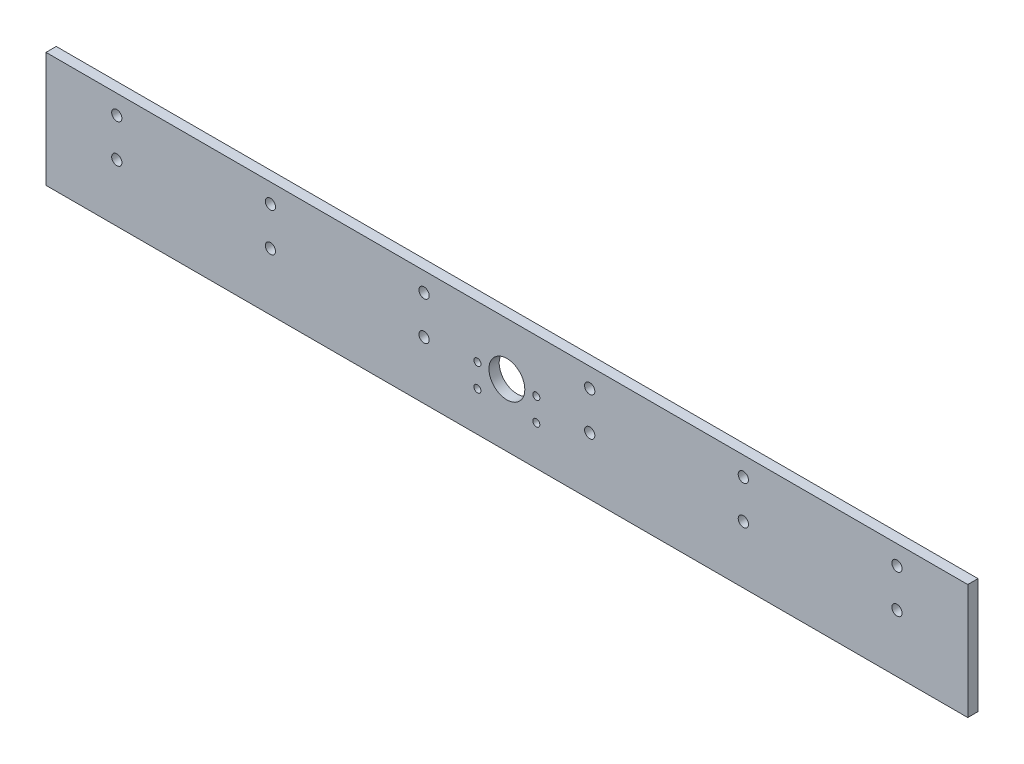
ISO-10303-21;
HEADER;
FILE_DESCRIPTION(('STEP AP214'),'2;1');
FILE_NAME('part.step','',(''),(''),'','','');
FILE_SCHEMA(('AUTOMOTIVE_DESIGN { 1 0 10303 214 1 1 1 1 }'));
ENDSEC;
DATA;
#1=APPLICATION_CONTEXT('core data for automotive mechanical design processes');
#2=APPLICATION_PROTOCOL_DEFINITION('international standard','automotive_design',2000,#1);
#3=PRODUCT_CONTEXT('',#1,'mechanical');
#4=PRODUCT('Part','Part','',(#3));
#5=PRODUCT_RELATED_PRODUCT_CATEGORY('part','',(#4));
#6=PRODUCT_DEFINITION_FORMATION('','',#4);
#7=PRODUCT_DEFINITION_CONTEXT('part definition',#1,'design');
#8=PRODUCT_DEFINITION('design','',#6,#7);
#9=PRODUCT_DEFINITION_SHAPE('','',#8);
#10=(LENGTH_UNIT() NAMED_UNIT(*) SI_UNIT(.MILLI.,.METRE.));
#11=(NAMED_UNIT(*) PLANE_ANGLE_UNIT() SI_UNIT($,.RADIAN.));
#12=(NAMED_UNIT(*) SI_UNIT($,.STERADIAN.) SOLID_ANGLE_UNIT());
#13=UNCERTAINTY_MEASURE_WITH_UNIT(LENGTH_MEASURE(1.E-05),#10,'distance_accuracy_value','');
#14=(GEOMETRIC_REPRESENTATION_CONTEXT(3) GLOBAL_UNCERTAINTY_ASSIGNED_CONTEXT((#13)) GLOBAL_UNIT_ASSIGNED_CONTEXT((#10,
#11,#12)) REPRESENTATION_CONTEXT('',''));
#15=CARTESIAN_POINT('',(0.,0.,0.));
#16=DIRECTION('',(0.,0.,1.));
#17=DIRECTION('',(1.,0.,0.));
#18=AXIS2_PLACEMENT_3D('',#15,#16,#17);
#19=CARTESIAN_POINT('',(0.,0.,8.));
#20=DIRECTION('',(0.,0.,-1.));
#21=DIRECTION('',(-1.,0.,0.));
#22=AXIS2_PLACEMENT_3D('',#19,#20,#21);
#23=PLANE('',#22);
#24=CARTESIAN_POINT('',(524.7,45.,8.));
#25=DIRECTION('',(0.,0.,1.));
#26=DIRECTION('',(-1.,0.,0.));
#27=AXIS2_PLACEMENT_3D('',#24,#25,#26);
#28=CIRCLE('',#27,3.99999999999999);
#29=CARTESIAN_POINT('',(520.7,45.,8.));
#30=VERTEX_POINT('',#29);
#31=EDGE_CURVE('E110',#30,#30,#28,.T.);
#32=ORIENTED_EDGE('',*,*,#31,.F.);
#33=EDGE_LOOP('',(#32));
#34=FACE_BOUND('',#33,.T.);
#35=CARTESIAN_POINT('',(404.7,45.,8.));
#36=DIRECTION('',(0.,0.,1.));
#37=DIRECTION('',(-1.,0.,0.));
#38=AXIS2_PLACEMENT_3D('',#35,#36,#37);
#39=CIRCLE('',#38,3.99999999999999);
#40=CARTESIAN_POINT('',(400.7,45.,8.));
#41=VERTEX_POINT('',#40);
#42=EDGE_CURVE('E122',#41,#41,#39,.T.);
#43=ORIENTED_EDGE('',*,*,#42,.F.);
#44=EDGE_LOOP('',(#43));
#45=FACE_BOUND('',#44,.T.);
#46=CARTESIAN_POINT('',(275.3,75.,8.));
#47=DIRECTION('',(0.,0.,1.));
#48=DIRECTION('',(1.,0.,0.));
#49=AXIS2_PLACEMENT_3D('',#46,#47,#48);
#50=CIRCLE('',#49,3.99999999999999);
#51=CARTESIAN_POINT('',(279.3,75.,8.));
#52=VERTEX_POINT('',#51);
#53=EDGE_CURVE('E134',#52,#52,#50,.T.);
#54=ORIENTED_EDGE('',*,*,#53,.F.);
#55=EDGE_LOOP('',(#54));
#56=FACE_BOUND('',#55,.T.);
#57=CARTESIAN_POINT('',(155.3,75.,8.));
#58=DIRECTION('',(0.,0.,1.));
#59=DIRECTION('',(1.,0.,0.));
#60=AXIS2_PLACEMENT_3D('',#57,#58,#59);
#61=CIRCLE('',#60,3.99999999999999);
#62=CARTESIAN_POINT('',(159.3,75.,8.));
#63=VERTEX_POINT('',#62);
#64=EDGE_CURVE('E146',#63,#63,#61,.T.);
#65=ORIENTED_EDGE('',*,*,#64,.F.);
#66=EDGE_LOOP('',(#65));
#67=FACE_BOUND('',#66,.T.);
#68=CARTESIAN_POINT('',(644.7,45.,8.));
#69=DIRECTION('',(0.,0.,1.));
#70=DIRECTION('',(-1.,0.,0.));
#71=AXIS2_PLACEMENT_3D('',#68,#69,#70);
#72=CIRCLE('',#71,3.99999999999999);
#73=CARTESIAN_POINT('',(640.7,45.,8.));
#74=VERTEX_POINT('',#73);
#75=EDGE_CURVE('E158',#74,#74,#72,.T.);
#76=ORIENTED_EDGE('',*,*,#75,.F.);
#77=EDGE_LOOP('',(#76));
#78=FACE_BOUND('',#77,.T.);
#79=CARTESIAN_POINT('',(35.3,75.,8.));
#80=DIRECTION('',(0.,0.,1.));
#81=DIRECTION('',(1.,0.,0.));
#82=AXIS2_PLACEMENT_3D('',#79,#80,#81);
#83=CIRCLE('',#82,4.00000000000001);
#84=CARTESIAN_POINT('',(39.3,75.,8.));
#85=VERTEX_POINT('',#84);
#86=EDGE_CURVE('E170',#85,#85,#83,.T.);
#87=ORIENTED_EDGE('',*,*,#86,.F.);
#88=EDGE_LOOP('',(#87));
#89=FACE_BOUND('',#88,.T.);
#90=CARTESIAN_POINT('',(363.000000000001,30.92,8.));
#91=DIRECTION('',(0.,0.,1.));
#92=DIRECTION('',(1.,0.,0.));
#93=AXIS2_PLACEMENT_3D('',#90,#91,#92);
#94=CIRCLE('',#93,2.74999999999998);
#95=CARTESIAN_POINT('',(365.750000000001,30.92,8.));
#96=VERTEX_POINT('',#95);
#97=EDGE_CURVE('E182',#96,#96,#94,.T.);
#98=ORIENTED_EDGE('',*,*,#97,.F.);
#99=EDGE_LOOP('',(#98));
#100=FACE_BOUND('',#99,.T.);
#101=CARTESIAN_POINT('',(340.,48.92,8.));
#102=DIRECTION('',(0.,0.,1.));
#103=DIRECTION('',(1.,0.,0.));
#104=AXIS2_PLACEMENT_3D('',#101,#102,#103);
#105=CIRCLE('',#104,14.);
#106=CARTESIAN_POINT('',(354.,48.92,8.));
#107=VERTEX_POINT('',#106);
#108=EDGE_CURVE('E194',#107,#107,#105,.T.);
#109=ORIENTED_EDGE('',*,*,#108,.F.);
#110=EDGE_LOOP('',(#109));
#111=FACE_BOUND('',#110,.T.);
#112=DIRECTION('',(-1.,0.,0.));
#113=VECTOR('',#112,1.);
#114=CARTESIAN_POINT('',(0.,90.,8.));
#115=LINE('',#114,#113);
#116=CARTESIAN_POINT('',(700.,90.0000000000001,8.));
#117=VERTEX_POINT('',#116);
#118=CARTESIAN_POINT('',(-20.,90.,8.));
#119=VERTEX_POINT('',#118);
#120=EDGE_CURVE('E11',#117,#119,#115,.T.);
#121=ORIENTED_EDGE('',*,*,#120,.T.);
#122=DIRECTION('',(0.,1.,0.));
#123=VECTOR('',#122,1.);
#124=CARTESIAN_POINT('',(-20.,90.,8.));
#125=LINE('',#124,#123);
#126=CARTESIAN_POINT('',(-20.,0.,8.));
#127=VERTEX_POINT('',#126);
#128=EDGE_CURVE('E75',#127,#119,#125,.T.);
#129=ORIENTED_EDGE('',*,*,#128,.F.);
#130=DIRECTION('',(1.,0.,0.));
#131=VECTOR('',#130,1.);
#132=CARTESIAN_POINT('',(0.,0.,8.));
#133=LINE('',#132,#131);
#134=CARTESIAN_POINT('',(700.,1.00242350743582E-13,8.));
#135=VERTEX_POINT('',#134);
#136=EDGE_CURVE('E41',#127,#135,#133,.T.);
#137=ORIENTED_EDGE('',*,*,#136,.T.);
#138=DIRECTION('',(0.,-1.,0.));
#139=VECTOR('',#138,1.);
#140=CARTESIAN_POINT('',(700.,90.0000000000001,8.));
#141=LINE('',#140,#139);
#142=EDGE_CURVE('E74',#117,#135,#141,.T.);
#143=ORIENTED_EDGE('',*,*,#142,.F.);
#144=EDGE_LOOP('',(#121,#129,#137,#143));
#145=FACE_BOUND('',#144,.T.);
#146=CARTESIAN_POINT('',(317.,48.92,8.));
#147=DIRECTION('',(0.,0.,1.));
#148=DIRECTION('',(1.,0.,0.));
#149=AXIS2_PLACEMENT_3D('',#146,#147,#148);
#150=CIRCLE('',#149,2.74999999999998);
#151=CARTESIAN_POINT('',(319.75,48.92,8.));
#152=VERTEX_POINT('',#151);
#153=EDGE_CURVE('E200',#152,#152,#150,.T.);
#154=ORIENTED_EDGE('',*,*,#153,.F.);
#155=EDGE_LOOP('',(#154));
#156=FACE_BOUND('',#155,.T.);
#157=CARTESIAN_POINT('',(363.,48.92,8.));
#158=DIRECTION('',(0.,0.,1.));
#159=DIRECTION('',(1.,0.,0.));
#160=AXIS2_PLACEMENT_3D('',#157,#158,#159);
#161=CIRCLE('',#160,2.74999999999998);
#162=CARTESIAN_POINT('',(365.75,48.92,8.));
#163=VERTEX_POINT('',#162);
#164=EDGE_CURVE('E188',#163,#163,#161,.T.);
#165=ORIENTED_EDGE('',*,*,#164,.F.);
#166=EDGE_LOOP('',(#165));
#167=FACE_BOUND('',#166,.T.);
#168=CARTESIAN_POINT('',(317.000000000001,30.92,8.));
#169=DIRECTION('',(0.,0.,1.));
#170=DIRECTION('',(1.,0.,0.));
#171=AXIS2_PLACEMENT_3D('',#168,#169,#170);
#172=CIRCLE('',#171,2.74999999999998);
#173=CARTESIAN_POINT('',(319.750000000001,30.92,8.));
#174=VERTEX_POINT('',#173);
#175=EDGE_CURVE('E176',#174,#174,#172,.T.);
#176=ORIENTED_EDGE('',*,*,#175,.F.);
#177=EDGE_LOOP('',(#176));
#178=FACE_BOUND('',#177,.T.);
#179=CARTESIAN_POINT('',(35.3,45.,8.));
#180=DIRECTION('',(0.,0.,1.));
#181=DIRECTION('',(1.,0.,0.));
#182=AXIS2_PLACEMENT_3D('',#179,#180,#181);
#183=CIRCLE('',#182,4.00000000000001);
#184=CARTESIAN_POINT('',(39.3,45.,8.));
#185=VERTEX_POINT('',#184);
#186=EDGE_CURVE('E164',#185,#185,#183,.T.);
#187=ORIENTED_EDGE('',*,*,#186,.F.);
#188=EDGE_LOOP('',(#187));
#189=FACE_BOUND('',#188,.T.);
#190=CARTESIAN_POINT('',(644.7,75.,8.));
#191=DIRECTION('',(0.,0.,1.));
#192=DIRECTION('',(-1.,0.,0.));
#193=AXIS2_PLACEMENT_3D('',#190,#191,#192);
#194=CIRCLE('',#193,3.99999999999999);
#195=CARTESIAN_POINT('',(640.7,75.,8.));
#196=VERTEX_POINT('',#195);
#197=EDGE_CURVE('E152',#196,#196,#194,.T.);
#198=ORIENTED_EDGE('',*,*,#197,.F.);
#199=EDGE_LOOP('',(#198));
#200=FACE_BOUND('',#199,.T.);
#201=CARTESIAN_POINT('',(155.3,45.,8.));
#202=DIRECTION('',(0.,0.,1.));
#203=DIRECTION('',(1.,0.,0.));
#204=AXIS2_PLACEMENT_3D('',#201,#202,#203);
#205=CIRCLE('',#204,3.99999999999999);
#206=CARTESIAN_POINT('',(159.3,45.,8.));
#207=VERTEX_POINT('',#206);
#208=EDGE_CURVE('E140',#207,#207,#205,.T.);
#209=ORIENTED_EDGE('',*,*,#208,.F.);
#210=EDGE_LOOP('',(#209));
#211=FACE_BOUND('',#210,.T.);
#212=CARTESIAN_POINT('',(275.3,45.,8.));
#213=DIRECTION('',(0.,0.,1.));
#214=DIRECTION('',(1.,0.,0.));
#215=AXIS2_PLACEMENT_3D('',#212,#213,#214);
#216=CIRCLE('',#215,3.99999999999999);
#217=CARTESIAN_POINT('',(279.3,45.,8.));
#218=VERTEX_POINT('',#217);
#219=EDGE_CURVE('E128',#218,#218,#216,.T.);
#220=ORIENTED_EDGE('',*,*,#219,.F.);
#221=EDGE_LOOP('',(#220));
#222=FACE_BOUND('',#221,.T.);
#223=CARTESIAN_POINT('',(404.7,75.,8.));
#224=DIRECTION('',(0.,0.,1.));
#225=DIRECTION('',(-1.,0.,0.));
#226=AXIS2_PLACEMENT_3D('',#223,#224,#225);
#227=CIRCLE('',#226,3.99999999999999);
#228=CARTESIAN_POINT('',(400.7,75.,8.));
#229=VERTEX_POINT('',#228);
#230=EDGE_CURVE('E116',#229,#229,#227,.T.);
#231=ORIENTED_EDGE('',*,*,#230,.F.);
#232=EDGE_LOOP('',(#231));
#233=FACE_BOUND('',#232,.T.);
#234=CARTESIAN_POINT('',(524.7,75.,8.));
#235=DIRECTION('',(0.,0.,1.));
#236=DIRECTION('',(-1.,0.,0.));
#237=AXIS2_PLACEMENT_3D('',#234,#235,#236);
#238=CIRCLE('',#237,3.99999999999999);
#239=CARTESIAN_POINT('',(520.7,75.,8.));
#240=VERTEX_POINT('',#239);
#241=EDGE_CURVE('E104',#240,#240,#238,.T.);
#242=ORIENTED_EDGE('',*,*,#241,.F.);
#243=EDGE_LOOP('',(#242));
#244=FACE_BOUND('',#243,.T.);
#245=ADVANCED_FACE('F32',(#34,#45,#56,#67,#78,#89,#100,#111,#145,#156,#167,#178,#189,#200,#211,
#222,#233,#244),#23,.F.);
#246=CARTESIAN_POINT('',(0.,0.,0.));
#247=DIRECTION('',(0.,0.,-1.));
#248=DIRECTION('',(-1.,0.,0.));
#249=AXIS2_PLACEMENT_3D('',#246,#247,#248);
#250=PLANE('',#249);
#251=CARTESIAN_POINT('',(524.7,45.,0.));
#252=DIRECTION('',(0.,0.,1.));
#253=DIRECTION('',(-1.,0.,0.));
#254=AXIS2_PLACEMENT_3D('',#251,#252,#253);
#255=CIRCLE('',#254,3.99999999999999);
#256=CARTESIAN_POINT('',(520.7,45.,0.));
#257=VERTEX_POINT('',#256);
#258=EDGE_CURVE('E107',#257,#257,#255,.T.);
#259=ORIENTED_EDGE('',*,*,#258,.T.);
#260=EDGE_LOOP('',(#259));
#261=FACE_BOUND('',#260,.T.);
#262=CARTESIAN_POINT('',(404.7,45.,0.));
#263=DIRECTION('',(0.,0.,1.));
#264=DIRECTION('',(-1.,0.,0.));
#265=AXIS2_PLACEMENT_3D('',#262,#263,#264);
#266=CIRCLE('',#265,3.99999999999999);
#267=CARTESIAN_POINT('',(400.7,45.,0.));
#268=VERTEX_POINT('',#267);
#269=EDGE_CURVE('E119',#268,#268,#266,.T.);
#270=ORIENTED_EDGE('',*,*,#269,.T.);
#271=EDGE_LOOP('',(#270));
#272=FACE_BOUND('',#271,.T.);
#273=CARTESIAN_POINT('',(275.3,75.,0.));
#274=DIRECTION('',(0.,0.,1.));
#275=DIRECTION('',(1.,0.,0.));
#276=AXIS2_PLACEMENT_3D('',#273,#274,#275);
#277=CIRCLE('',#276,3.99999999999999);
#278=CARTESIAN_POINT('',(279.3,75.,0.));
#279=VERTEX_POINT('',#278);
#280=EDGE_CURVE('E131',#279,#279,#277,.T.);
#281=ORIENTED_EDGE('',*,*,#280,.T.);
#282=EDGE_LOOP('',(#281));
#283=FACE_BOUND('',#282,.T.);
#284=CARTESIAN_POINT('',(155.3,75.,0.));
#285=DIRECTION('',(0.,0.,1.));
#286=DIRECTION('',(1.,0.,0.));
#287=AXIS2_PLACEMENT_3D('',#284,#285,#286);
#288=CIRCLE('',#287,3.99999999999999);
#289=CARTESIAN_POINT('',(159.3,75.,0.));
#290=VERTEX_POINT('',#289);
#291=EDGE_CURVE('E143',#290,#290,#288,.T.);
#292=ORIENTED_EDGE('',*,*,#291,.T.);
#293=EDGE_LOOP('',(#292));
#294=FACE_BOUND('',#293,.T.);
#295=CARTESIAN_POINT('',(644.7,45.,0.));
#296=DIRECTION('',(0.,0.,1.));
#297=DIRECTION('',(-1.,0.,0.));
#298=AXIS2_PLACEMENT_3D('',#295,#296,#297);
#299=CIRCLE('',#298,3.99999999999999);
#300=CARTESIAN_POINT('',(640.7,45.,0.));
#301=VERTEX_POINT('',#300);
#302=EDGE_CURVE('E155',#301,#301,#299,.T.);
#303=ORIENTED_EDGE('',*,*,#302,.T.);
#304=EDGE_LOOP('',(#303));
#305=FACE_BOUND('',#304,.T.);
#306=CARTESIAN_POINT('',(35.3,75.,0.));
#307=DIRECTION('',(0.,0.,1.));
#308=DIRECTION('',(1.,0.,0.));
#309=AXIS2_PLACEMENT_3D('',#306,#307,#308);
#310=CIRCLE('',#309,4.00000000000001);
#311=CARTESIAN_POINT('',(39.3,75.,0.));
#312=VERTEX_POINT('',#311);
#313=EDGE_CURVE('E167',#312,#312,#310,.T.);
#314=ORIENTED_EDGE('',*,*,#313,.T.);
#315=EDGE_LOOP('',(#314));
#316=FACE_BOUND('',#315,.T.);
#317=CARTESIAN_POINT('',(363.000000000001,30.92,0.));
#318=DIRECTION('',(0.,0.,1.));
#319=DIRECTION('',(1.,0.,0.));
#320=AXIS2_PLACEMENT_3D('',#317,#318,#319);
#321=CIRCLE('',#320,2.74999999999998);
#322=CARTESIAN_POINT('',(365.750000000001,30.92,0.));
#323=VERTEX_POINT('',#322);
#324=EDGE_CURVE('E179',#323,#323,#321,.T.);
#325=ORIENTED_EDGE('',*,*,#324,.T.);
#326=EDGE_LOOP('',(#325));
#327=FACE_BOUND('',#326,.T.);
#328=CARTESIAN_POINT('',(340.,48.92,0.));
#329=DIRECTION('',(0.,0.,1.));
#330=DIRECTION('',(1.,0.,0.));
#331=AXIS2_PLACEMENT_3D('',#328,#329,#330);
#332=CIRCLE('',#331,14.);
#333=CARTESIAN_POINT('',(354.,48.92,0.));
#334=VERTEX_POINT('',#333);
#335=EDGE_CURVE('E191',#334,#334,#332,.T.);
#336=ORIENTED_EDGE('',*,*,#335,.T.);
#337=EDGE_LOOP('',(#336));
#338=FACE_BOUND('',#337,.T.);
#339=DIRECTION('',(1.,0.,0.));
#340=VECTOR('',#339,1.);
#341=CARTESIAN_POINT('',(0.,0.,0.));
#342=LINE('',#341,#340);
#343=CARTESIAN_POINT('',(-20.,0.,0.));
#344=VERTEX_POINT('',#343);
#345=CARTESIAN_POINT('',(700.,1.00242350743582E-13,0.));
#346=VERTEX_POINT('',#345);
#347=EDGE_CURVE('E82',#344,#346,#342,.T.);
#348=ORIENTED_EDGE('',*,*,#347,.F.);
#349=DIRECTION('',(0.,-1.,0.));
#350=VECTOR('',#349,1.);
#351=CARTESIAN_POINT('',(-20.,90.,0.));
#352=LINE('',#351,#350);
#353=CARTESIAN_POINT('',(-20.,90.,0.));
#354=VERTEX_POINT('',#353);
#355=EDGE_CURVE('E95',#354,#344,#352,.T.);
#356=ORIENTED_EDGE('',*,*,#355,.F.);
#357=DIRECTION('',(-1.,0.,0.));
#358=VECTOR('',#357,1.);
#359=CARTESIAN_POINT('',(0.,90.,0.));
#360=LINE('',#359,#358);
#361=CARTESIAN_POINT('',(700.,90.0000000000001,0.));
#362=VERTEX_POINT('',#361);
#363=EDGE_CURVE('E36',#362,#354,#360,.T.);
#364=ORIENTED_EDGE('',*,*,#363,.F.);
#365=DIRECTION('',(0.,1.,0.));
#366=VECTOR('',#365,1.);
#367=CARTESIAN_POINT('',(700.,90.0000000000001,0.));
#368=LINE('',#367,#366);
#369=EDGE_CURVE('E86',#346,#362,#368,.T.);
#370=ORIENTED_EDGE('',*,*,#369,.F.);
#371=EDGE_LOOP('',(#348,#356,#364,#370));
#372=FACE_BOUND('',#371,.T.);
#373=CARTESIAN_POINT('',(317.,48.92,0.));
#374=DIRECTION('',(0.,0.,1.));
#375=DIRECTION('',(1.,0.,0.));
#376=AXIS2_PLACEMENT_3D('',#373,#374,#375);
#377=CIRCLE('',#376,2.74999999999998);
#378=CARTESIAN_POINT('',(319.75,48.92,0.));
#379=VERTEX_POINT('',#378);
#380=EDGE_CURVE('E197',#379,#379,#377,.T.);
#381=ORIENTED_EDGE('',*,*,#380,.T.);
#382=EDGE_LOOP('',(#381));
#383=FACE_BOUND('',#382,.T.);
#384=CARTESIAN_POINT('',(363.,48.92,0.));
#385=DIRECTION('',(0.,0.,1.));
#386=DIRECTION('',(1.,0.,0.));
#387=AXIS2_PLACEMENT_3D('',#384,#385,#386);
#388=CIRCLE('',#387,2.74999999999998);
#389=CARTESIAN_POINT('',(365.75,48.92,0.));
#390=VERTEX_POINT('',#389);
#391=EDGE_CURVE('E185',#390,#390,#388,.T.);
#392=ORIENTED_EDGE('',*,*,#391,.T.);
#393=EDGE_LOOP('',(#392));
#394=FACE_BOUND('',#393,.T.);
#395=CARTESIAN_POINT('',(317.000000000001,30.92,0.));
#396=DIRECTION('',(0.,0.,1.));
#397=DIRECTION('',(1.,0.,0.));
#398=AXIS2_PLACEMENT_3D('',#395,#396,#397);
#399=CIRCLE('',#398,2.74999999999998);
#400=CARTESIAN_POINT('',(319.750000000001,30.92,0.));
#401=VERTEX_POINT('',#400);
#402=EDGE_CURVE('E173',#401,#401,#399,.T.);
#403=ORIENTED_EDGE('',*,*,#402,.T.);
#404=EDGE_LOOP('',(#403));
#405=FACE_BOUND('',#404,.T.);
#406=CARTESIAN_POINT('',(35.3,45.,0.));
#407=DIRECTION('',(0.,0.,1.));
#408=DIRECTION('',(1.,0.,0.));
#409=AXIS2_PLACEMENT_3D('',#406,#407,#408);
#410=CIRCLE('',#409,4.00000000000001);
#411=CARTESIAN_POINT('',(39.3,45.,0.));
#412=VERTEX_POINT('',#411);
#413=EDGE_CURVE('E161',#412,#412,#410,.T.);
#414=ORIENTED_EDGE('',*,*,#413,.T.);
#415=EDGE_LOOP('',(#414));
#416=FACE_BOUND('',#415,.T.);
#417=CARTESIAN_POINT('',(644.7,75.,0.));
#418=DIRECTION('',(0.,0.,1.));
#419=DIRECTION('',(-1.,0.,0.));
#420=AXIS2_PLACEMENT_3D('',#417,#418,#419);
#421=CIRCLE('',#420,3.99999999999999);
#422=CARTESIAN_POINT('',(640.7,75.,0.));
#423=VERTEX_POINT('',#422);
#424=EDGE_CURVE('E149',#423,#423,#421,.T.);
#425=ORIENTED_EDGE('',*,*,#424,.T.);
#426=EDGE_LOOP('',(#425));
#427=FACE_BOUND('',#426,.T.);
#428=CARTESIAN_POINT('',(155.3,45.,0.));
#429=DIRECTION('',(0.,0.,1.));
#430=DIRECTION('',(1.,0.,0.));
#431=AXIS2_PLACEMENT_3D('',#428,#429,#430);
#432=CIRCLE('',#431,3.99999999999999);
#433=CARTESIAN_POINT('',(159.3,45.,0.));
#434=VERTEX_POINT('',#433);
#435=EDGE_CURVE('E137',#434,#434,#432,.T.);
#436=ORIENTED_EDGE('',*,*,#435,.T.);
#437=EDGE_LOOP('',(#436));
#438=FACE_BOUND('',#437,.T.);
#439=CARTESIAN_POINT('',(275.3,45.,0.));
#440=DIRECTION('',(0.,0.,1.));
#441=DIRECTION('',(1.,0.,0.));
#442=AXIS2_PLACEMENT_3D('',#439,#440,#441);
#443=CIRCLE('',#442,3.99999999999999);
#444=CARTESIAN_POINT('',(279.3,45.,0.));
#445=VERTEX_POINT('',#444);
#446=EDGE_CURVE('E125',#445,#445,#443,.T.);
#447=ORIENTED_EDGE('',*,*,#446,.T.);
#448=EDGE_LOOP('',(#447));
#449=FACE_BOUND('',#448,.T.);
#450=CARTESIAN_POINT('',(404.7,75.,0.));
#451=DIRECTION('',(0.,0.,1.));
#452=DIRECTION('',(-1.,0.,0.));
#453=AXIS2_PLACEMENT_3D('',#450,#451,#452);
#454=CIRCLE('',#453,3.99999999999999);
#455=CARTESIAN_POINT('',(400.7,75.,0.));
#456=VERTEX_POINT('',#455);
#457=EDGE_CURVE('E113',#456,#456,#454,.T.);
#458=ORIENTED_EDGE('',*,*,#457,.T.);
#459=EDGE_LOOP('',(#458));
#460=FACE_BOUND('',#459,.T.);
#461=CARTESIAN_POINT('',(524.7,75.,0.));
#462=DIRECTION('',(0.,0.,1.));
#463=DIRECTION('',(-1.,0.,0.));
#464=AXIS2_PLACEMENT_3D('',#461,#462,#463);
#465=CIRCLE('',#464,3.99999999999999);
#466=CARTESIAN_POINT('',(520.7,75.,0.));
#467=VERTEX_POINT('',#466);
#468=EDGE_CURVE('E103',#467,#467,#465,.T.);
#469=ORIENTED_EDGE('',*,*,#468,.T.);
#470=EDGE_LOOP('',(#469));
#471=FACE_BOUND('',#470,.T.);
#472=ADVANCED_FACE('F206',(#261,#272,#283,#294,#305,#316,#327,#338,#372,#383,#394,#405,#416,
#427,#438,#449,#460,#471),#250,.T.);
#473=CARTESIAN_POINT('',(0.,0.,8.));
#474=DIRECTION('',(0.,1.,0.));
#475=DIRECTION('',(-1.,0.,0.));
#476=AXIS2_PLACEMENT_3D('',#473,#474,#475);
#477=PLANE('',#476);
#478=ORIENTED_EDGE('',*,*,#347,.T.);
#479=DIRECTION('',(0.,0.,-1.));
#480=VECTOR('',#479,1.);
#481=CARTESIAN_POINT('',(700.,1.00242350743582E-13,8.));
#482=LINE('',#481,#480);
#483=EDGE_CURVE('E81',#135,#346,#482,.T.);
#484=ORIENTED_EDGE('',*,*,#483,.F.);
#485=ORIENTED_EDGE('',*,*,#136,.F.);
#486=DIRECTION('',(0.,0.,1.));
#487=VECTOR('',#486,1.);
#488=CARTESIAN_POINT('',(-20.,0.,0.));
#489=LINE('',#488,#487);
#490=EDGE_CURVE('E98',#344,#127,#489,.T.);
#491=ORIENTED_EDGE('',*,*,#490,.F.);
#492=EDGE_LOOP('',(#478,#484,#485,#491));
#493=FACE_BOUND('',#492,.T.);
#494=ADVANCED_FACE('F34',(#493),#477,.F.);
#495=CARTESIAN_POINT('',(0.,90.,8.));
#496=DIRECTION('',(0.,-1.,0.));
#497=DIRECTION('',(1.,0.,0.));
#498=AXIS2_PLACEMENT_3D('',#495,#496,#497);
#499=PLANE('',#498);
#500=ORIENTED_EDGE('',*,*,#363,.T.);
#501=DIRECTION('',(0.,0.,-1.));
#502=VECTOR('',#501,1.);
#503=CARTESIAN_POINT('',(-20.,90.,0.));
#504=LINE('',#503,#502);
#505=EDGE_CURVE('E101',#119,#354,#504,.T.);
#506=ORIENTED_EDGE('',*,*,#505,.F.);
#507=ORIENTED_EDGE('',*,*,#120,.F.);
#508=DIRECTION('',(0.,0.,1.));
#509=VECTOR('',#508,1.);
#510=CARTESIAN_POINT('',(700.,90.0000000000001,8.));
#511=LINE('',#510,#509);
#512=EDGE_CURVE('E90',#362,#117,#511,.T.);
#513=ORIENTED_EDGE('',*,*,#512,.F.);
#514=EDGE_LOOP('',(#500,#506,#507,#513));
#515=FACE_BOUND('',#514,.T.);
#516=ADVANCED_FACE('F212',(#515),#499,.F.);
#517=CARTESIAN_POINT('',(317.,48.92,8.));
#518=DIRECTION('',(0.,0.,-1.));
#519=DIRECTION('',(-1.,0.,0.));
#520=AXIS2_PLACEMENT_3D('',#517,#518,#519);
#521=CYLINDRICAL_SURFACE('',#520,2.74999999999998);
#522=ORIENTED_EDGE('',*,*,#153,.T.);
#523=EDGE_LOOP('',(#522));
#524=FACE_BOUND('',#523,.T.);
#525=ORIENTED_EDGE('',*,*,#380,.F.);
#526=EDGE_LOOP('',(#525));
#527=FACE_BOUND('',#526,.T.);
#528=ADVANCED_FACE('F209',(#524,#527),#521,.F.);
#529=CARTESIAN_POINT('',(340.,48.92,8.));
#530=DIRECTION('',(0.,0.,-1.));
#531=DIRECTION('',(-1.,0.,0.));
#532=AXIS2_PLACEMENT_3D('',#529,#530,#531);
#533=CYLINDRICAL_SURFACE('',#532,14.);
#534=ORIENTED_EDGE('',*,*,#108,.T.);
#535=EDGE_LOOP('',(#534));
#536=FACE_BOUND('',#535,.T.);
#537=ORIENTED_EDGE('',*,*,#335,.F.);
#538=EDGE_LOOP('',(#537));
#539=FACE_BOUND('',#538,.T.);
#540=ADVANCED_FACE('F211',(#536,#539),#533,.F.);
#541=CARTESIAN_POINT('',(363.,48.92,8.));
#542=DIRECTION('',(0.,0.,-1.));
#543=DIRECTION('',(-1.,0.,0.));
#544=AXIS2_PLACEMENT_3D('',#541,#542,#543);
#545=CYLINDRICAL_SURFACE('',#544,2.74999999999998);
#546=ORIENTED_EDGE('',*,*,#164,.T.);
#547=EDGE_LOOP('',(#546));
#548=FACE_BOUND('',#547,.T.);
#549=ORIENTED_EDGE('',*,*,#391,.F.);
#550=EDGE_LOOP('',(#549));
#551=FACE_BOUND('',#550,.T.);
#552=ADVANCED_FACE('F219',(#548,#551),#545,.F.);
#553=CARTESIAN_POINT('',(363.000000000001,30.92,8.));
#554=DIRECTION('',(0.,0.,-1.));
#555=DIRECTION('',(-1.,0.,0.));
#556=AXIS2_PLACEMENT_3D('',#553,#554,#555);
#557=CYLINDRICAL_SURFACE('',#556,2.74999999999998);
#558=ORIENTED_EDGE('',*,*,#97,.T.);
#559=EDGE_LOOP('',(#558));
#560=FACE_BOUND('',#559,.T.);
#561=ORIENTED_EDGE('',*,*,#324,.F.);
#562=EDGE_LOOP('',(#561));
#563=FACE_BOUND('',#562,.T.);
#564=ADVANCED_FACE('F310',(#560,#563),#557,.F.);
#565=CARTESIAN_POINT('',(317.000000000001,30.92,8.));
#566=DIRECTION('',(0.,0.,-1.));
#567=DIRECTION('',(-1.,0.,0.));
#568=AXIS2_PLACEMENT_3D('',#565,#566,#567);
#569=CYLINDRICAL_SURFACE('',#568,2.74999999999998);
#570=ORIENTED_EDGE('',*,*,#175,.T.);
#571=EDGE_LOOP('',(#570));
#572=FACE_BOUND('',#571,.T.);
#573=ORIENTED_EDGE('',*,*,#402,.F.);
#574=EDGE_LOOP('',(#573));
#575=FACE_BOUND('',#574,.T.);
#576=ADVANCED_FACE('F306',(#572,#575),#569,.F.);
#577=CARTESIAN_POINT('',(35.3,75.,8.));
#578=DIRECTION('',(0.,0.,-1.));
#579=DIRECTION('',(-1.,0.,0.));
#580=AXIS2_PLACEMENT_3D('',#577,#578,#579);
#581=CYLINDRICAL_SURFACE('',#580,4.00000000000001);
#582=ORIENTED_EDGE('',*,*,#86,.T.);
#583=EDGE_LOOP('',(#582));
#584=FACE_BOUND('',#583,.T.);
#585=ORIENTED_EDGE('',*,*,#313,.F.);
#586=EDGE_LOOP('',(#585));
#587=FACE_BOUND('',#586,.T.);
#588=ADVANCED_FACE('F302',(#584,#587),#581,.F.);
#589=CARTESIAN_POINT('',(35.3,45.,8.));
#590=DIRECTION('',(0.,0.,-1.));
#591=DIRECTION('',(-1.,0.,0.));
#592=AXIS2_PLACEMENT_3D('',#589,#590,#591);
#593=CYLINDRICAL_SURFACE('',#592,4.00000000000001);
#594=ORIENTED_EDGE('',*,*,#186,.T.);
#595=EDGE_LOOP('',(#594));
#596=FACE_BOUND('',#595,.T.);
#597=ORIENTED_EDGE('',*,*,#413,.F.);
#598=EDGE_LOOP('',(#597));
#599=FACE_BOUND('',#598,.T.);
#600=ADVANCED_FACE('F298',(#596,#599),#593,.F.);
#601=CARTESIAN_POINT('',(644.7,45.,8.));
#602=DIRECTION('',(0.,0.,-1.));
#603=DIRECTION('',(-1.,0.,0.));
#604=AXIS2_PLACEMENT_3D('',#601,#602,#603);
#605=CYLINDRICAL_SURFACE('',#604,3.99999999999999);
#606=ORIENTED_EDGE('',*,*,#75,.T.);
#607=EDGE_LOOP('',(#606));
#608=FACE_BOUND('',#607,.T.);
#609=ORIENTED_EDGE('',*,*,#302,.F.);
#610=EDGE_LOOP('',(#609));
#611=FACE_BOUND('',#610,.T.);
#612=ADVANCED_FACE('F294',(#608,#611),#605,.F.);
#613=CARTESIAN_POINT('',(644.7,75.,8.));
#614=DIRECTION('',(0.,0.,-1.));
#615=DIRECTION('',(-1.,0.,0.));
#616=AXIS2_PLACEMENT_3D('',#613,#614,#615);
#617=CYLINDRICAL_SURFACE('',#616,3.99999999999999);
#618=ORIENTED_EDGE('',*,*,#197,.T.);
#619=EDGE_LOOP('',(#618));
#620=FACE_BOUND('',#619,.T.);
#621=ORIENTED_EDGE('',*,*,#424,.F.);
#622=EDGE_LOOP('',(#621));
#623=FACE_BOUND('',#622,.T.);
#624=ADVANCED_FACE('F290',(#620,#623),#617,.F.);
#625=CARTESIAN_POINT('',(155.3,75.,8.));
#626=DIRECTION('',(0.,0.,-1.));
#627=DIRECTION('',(-1.,0.,0.));
#628=AXIS2_PLACEMENT_3D('',#625,#626,#627);
#629=CYLINDRICAL_SURFACE('',#628,3.99999999999999);
#630=ORIENTED_EDGE('',*,*,#64,.T.);
#631=EDGE_LOOP('',(#630));
#632=FACE_BOUND('',#631,.T.);
#633=ORIENTED_EDGE('',*,*,#291,.F.);
#634=EDGE_LOOP('',(#633));
#635=FACE_BOUND('',#634,.T.);
#636=ADVANCED_FACE('F286',(#632,#635),#629,.F.);
#637=CARTESIAN_POINT('',(155.3,45.,8.));
#638=DIRECTION('',(0.,0.,-1.));
#639=DIRECTION('',(-1.,0.,0.));
#640=AXIS2_PLACEMENT_3D('',#637,#638,#639);
#641=CYLINDRICAL_SURFACE('',#640,3.99999999999999);
#642=ORIENTED_EDGE('',*,*,#208,.T.);
#643=EDGE_LOOP('',(#642));
#644=FACE_BOUND('',#643,.T.);
#645=ORIENTED_EDGE('',*,*,#435,.F.);
#646=EDGE_LOOP('',(#645));
#647=FACE_BOUND('',#646,.T.);
#648=ADVANCED_FACE('F282',(#644,#647),#641,.F.);
#649=CARTESIAN_POINT('',(275.3,75.,8.));
#650=DIRECTION('',(0.,0.,-1.));
#651=DIRECTION('',(-1.,0.,0.));
#652=AXIS2_PLACEMENT_3D('',#649,#650,#651);
#653=CYLINDRICAL_SURFACE('',#652,3.99999999999999);
#654=ORIENTED_EDGE('',*,*,#53,.T.);
#655=EDGE_LOOP('',(#654));
#656=FACE_BOUND('',#655,.T.);
#657=ORIENTED_EDGE('',*,*,#280,.F.);
#658=EDGE_LOOP('',(#657));
#659=FACE_BOUND('',#658,.T.);
#660=ADVANCED_FACE('F278',(#656,#659),#653,.F.);
#661=CARTESIAN_POINT('',(275.3,45.,8.));
#662=DIRECTION('',(0.,0.,-1.));
#663=DIRECTION('',(-1.,0.,0.));
#664=AXIS2_PLACEMENT_3D('',#661,#662,#663);
#665=CYLINDRICAL_SURFACE('',#664,3.99999999999999);
#666=ORIENTED_EDGE('',*,*,#219,.T.);
#667=EDGE_LOOP('',(#666));
#668=FACE_BOUND('',#667,.T.);
#669=ORIENTED_EDGE('',*,*,#446,.F.);
#670=EDGE_LOOP('',(#669));
#671=FACE_BOUND('',#670,.T.);
#672=ADVANCED_FACE('F274',(#668,#671),#665,.F.);
#673=CARTESIAN_POINT('',(404.7,45.,8.));
#674=DIRECTION('',(0.,0.,-1.));
#675=DIRECTION('',(-1.,0.,0.));
#676=AXIS2_PLACEMENT_3D('',#673,#674,#675);
#677=CYLINDRICAL_SURFACE('',#676,3.99999999999999);
#678=ORIENTED_EDGE('',*,*,#42,.T.);
#679=EDGE_LOOP('',(#678));
#680=FACE_BOUND('',#679,.T.);
#681=ORIENTED_EDGE('',*,*,#269,.F.);
#682=EDGE_LOOP('',(#681));
#683=FACE_BOUND('',#682,.T.);
#684=ADVANCED_FACE('F270',(#680,#683),#677,.F.);
#685=CARTESIAN_POINT('',(404.7,75.,8.));
#686=DIRECTION('',(0.,0.,-1.));
#687=DIRECTION('',(-1.,0.,0.));
#688=AXIS2_PLACEMENT_3D('',#685,#686,#687);
#689=CYLINDRICAL_SURFACE('',#688,3.99999999999999);
#690=ORIENTED_EDGE('',*,*,#230,.T.);
#691=EDGE_LOOP('',(#690));
#692=FACE_BOUND('',#691,.T.);
#693=ORIENTED_EDGE('',*,*,#457,.F.);
#694=EDGE_LOOP('',(#693));
#695=FACE_BOUND('',#694,.T.);
#696=ADVANCED_FACE('F266',(#692,#695),#689,.F.);
#697=CARTESIAN_POINT('',(524.7,45.,8.));
#698=DIRECTION('',(0.,0.,-1.));
#699=DIRECTION('',(-1.,0.,0.));
#700=AXIS2_PLACEMENT_3D('',#697,#698,#699);
#701=CYLINDRICAL_SURFACE('',#700,3.99999999999999);
#702=ORIENTED_EDGE('',*,*,#31,.T.);
#703=EDGE_LOOP('',(#702));
#704=FACE_BOUND('',#703,.T.);
#705=ORIENTED_EDGE('',*,*,#258,.F.);
#706=EDGE_LOOP('',(#705));
#707=FACE_BOUND('',#706,.T.);
#708=ADVANCED_FACE('F260',(#704,#707),#701,.F.);
#709=CARTESIAN_POINT('',(524.7,75.,8.));
#710=DIRECTION('',(0.,0.,-1.));
#711=DIRECTION('',(-1.,0.,0.));
#712=AXIS2_PLACEMENT_3D('',#709,#710,#711);
#713=CYLINDRICAL_SURFACE('',#712,3.99999999999999);
#714=ORIENTED_EDGE('',*,*,#241,.T.);
#715=EDGE_LOOP('',(#714));
#716=FACE_BOUND('',#715,.T.);
#717=ORIENTED_EDGE('',*,*,#468,.F.);
#718=EDGE_LOOP('',(#717));
#719=FACE_BOUND('',#718,.T.);
#720=ADVANCED_FACE('F253',(#716,#719),#713,.F.);
#721=CARTESIAN_POINT('',(-20.,0.,0.));
#722=DIRECTION('',(-1.,0.,0.));
#723=DIRECTION('',(0.,-1.,0.));
#724=AXIS2_PLACEMENT_3D('',#721,#722,#723);
#725=PLANE('',#724);
#726=ORIENTED_EDGE('',*,*,#355,.T.);
#727=ORIENTED_EDGE('',*,*,#490,.T.);
#728=ORIENTED_EDGE('',*,*,#128,.T.);
#729=ORIENTED_EDGE('',*,*,#505,.T.);
#730=EDGE_LOOP('',(#726,#727,#728,#729));
#731=FACE_BOUND('',#730,.T.);
#732=ADVANCED_FACE('F251',(#731),#725,.T.);
#733=CARTESIAN_POINT('',(700.,-8.63506796930678E-13,0.));
#734=DIRECTION('',(1.,0.,0.));
#735=DIRECTION('',(0.,1.,0.));
#736=AXIS2_PLACEMENT_3D('',#733,#734,#735);
#737=PLANE('',#736);
#738=ORIENTED_EDGE('',*,*,#142,.T.);
#739=ORIENTED_EDGE('',*,*,#483,.T.);
#740=ORIENTED_EDGE('',*,*,#369,.T.);
#741=ORIENTED_EDGE('',*,*,#512,.T.);
#742=EDGE_LOOP('',(#738,#739,#740,#741));
#743=FACE_BOUND('',#742,.T.);
#744=ADVANCED_FACE('F89',(#743),#737,.T.);
#745=CLOSED_SHELL('',(#245,#472,#494,#516,#528,#540,#552,#564,#576,#588,#600,#612,#624,#636,
#648,#660,#672,#684,#696,#708,#720,#732,#744));
#746=MANIFOLD_SOLID_BREP('B2',#745);
#747=ADVANCED_BREP_SHAPE_REPRESENTATION('',(#18,#746),#14);
#748=SHAPE_DEFINITION_REPRESENTATION(#9,#747);
ENDSEC;
END-ISO-10303-21;
